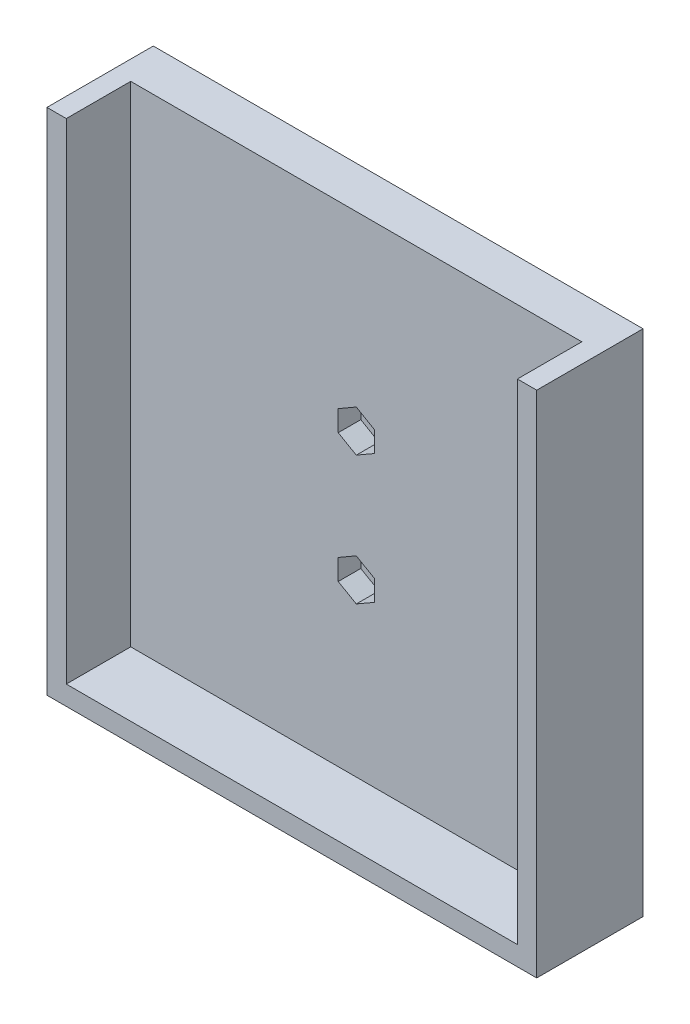
ISO-10303-21;
HEADER;
FILE_DESCRIPTION(('STEP AP214'),'2;1');
FILE_NAME('part.step','',(''),(''),'','','');
FILE_SCHEMA(('AUTOMOTIVE_DESIGN { 1 0 10303 214 1 1 1 1 }'));
ENDSEC;
DATA;
#1=APPLICATION_CONTEXT('core data for automotive mechanical design processes');
#2=APPLICATION_PROTOCOL_DEFINITION('international standard','automotive_design',2000,#1);
#3=PRODUCT_CONTEXT('',#1,'mechanical');
#4=PRODUCT('Part','Part','',(#3));
#5=PRODUCT_RELATED_PRODUCT_CATEGORY('part','',(#4));
#6=PRODUCT_DEFINITION_FORMATION('','',#4);
#7=PRODUCT_DEFINITION_CONTEXT('part definition',#1,'design');
#8=PRODUCT_DEFINITION('design','',#6,#7);
#9=PRODUCT_DEFINITION_SHAPE('','',#8);
#10=(LENGTH_UNIT() NAMED_UNIT(*) SI_UNIT(.MILLI.,.METRE.));
#11=(NAMED_UNIT(*) PLANE_ANGLE_UNIT() SI_UNIT($,.RADIAN.));
#12=(NAMED_UNIT(*) SI_UNIT($,.STERADIAN.) SOLID_ANGLE_UNIT());
#13=UNCERTAINTY_MEASURE_WITH_UNIT(LENGTH_MEASURE(1.E-05),#10,'distance_accuracy_value','');
#14=(GEOMETRIC_REPRESENTATION_CONTEXT(3) GLOBAL_UNCERTAINTY_ASSIGNED_CONTEXT((#13)) GLOBAL_UNIT_ASSIGNED_CONTEXT((#10,
#11,#12)) REPRESENTATION_CONTEXT('',''));
#15=CARTESIAN_POINT('',(0.,0.,0.));
#16=DIRECTION('',(0.,0.,1.));
#17=DIRECTION('',(1.,0.,0.));
#18=AXIS2_PLACEMENT_3D('',#15,#16,#17);
#19=CARTESIAN_POINT('',(0.,0.,3.));
#20=DIRECTION('',(0.,0.,1.));
#21=DIRECTION('',(1.,0.,0.));
#22=AXIS2_PLACEMENT_3D('',#19,#20,#21);
#23=PLANE('',#22);
#24=DIRECTION('',(-0.866025433586759,0.499999948380864,0.));
#25=VECTOR('',#24,1.);
#26=CARTESIAN_POINT('',(-2.86506319182696,-11.5790166188481,3.));
#27=LINE('',#26,#25);
#28=CARTESIAN_POINT('',(1.92711436808324E-07,-13.2331615074619,3.));
#29=VERTEX_POINT('',#28);
#30=CARTESIAN_POINT('',(-2.79999990364428,-11.6165809206239,3.));
#31=VERTEX_POINT('',#30);
#32=EDGE_CURVE('E387',#29,#31,#27,.T.);
#33=ORIENTED_EDGE('',*,*,#32,.T.);
#34=DIRECTION('',(-5.96046428127886E-08,1.,0.));
#35=VECTOR('',#34,1.);
#36=CARTESIAN_POINT('',(-2.80000024984535,-5.80829054375849,3.));
#37=LINE('',#36,#35);
#38=CARTESIAN_POINT('',(-2.80000009635571,-8.38341941316205,3.));
#39=VERTEX_POINT('',#38);
#40=EDGE_CURVE('E430',#31,#39,#37,.T.);
#41=ORIENTED_EDGE('',*,*,#40,.T.);
#42=DIRECTION('',(0.866025373982116,0.500000051619134,0.));
#43=VECTOR('',#42,1.);
#44=CARTESIAN_POINT('',(0.0650635380280448,-6.72927392491038,3.));
#45=LINE('',#44,#43);
#46=CARTESIAN_POINT('',(-1.92711437363435E-07,-6.7668384925381,3.));
#47=VERTEX_POINT('',#46);
#48=EDGE_CURVE('E375',#39,#47,#45,.T.);
#49=ORIENTED_EDGE('',*,*,#48,.T.);
#50=DIRECTION('',(0.866025433586759,-0.499999948380864,0.));
#51=VECTOR('',#50,1.);
#52=CARTESIAN_POINT('',(-1.46506352907198,-5.92098389734326,3.));
#53=LINE('',#52,#51);
#54=CARTESIAN_POINT('',(2.79999990364427,-8.38341907937605,3.));
#55=VERTEX_POINT('',#54);
#56=EDGE_CURVE('E337',#47,#55,#53,.T.);
#57=ORIENTED_EDGE('',*,*,#56,.T.);
#58=DIRECTION('',(5.96046429844817E-08,-1.,0.));
#59=VECTOR('',#58,1.);
#60=CARTESIAN_POINT('',(2.79999965379892,-4.19170945624154,3.));
#61=LINE('',#60,#59);
#62=CARTESIAN_POINT('',(2.80000009635571,-11.6165805868379,3.));
#63=VERTEX_POINT('',#62);
#64=EDGE_CURVE('E383',#55,#63,#61,.T.);
#65=ORIENTED_EDGE('',*,*,#64,.T.);
#66=DIRECTION('',(-0.866025373982116,-0.500000051619134,0.));
#67=VECTOR('',#66,1.);
#68=CARTESIAN_POINT('',(4.26506377891733,-10.7707255588983,3.));
#69=LINE('',#68,#67);
#70=EDGE_CURVE('E352',#63,#29,#69,.T.);
#71=ORIENTED_EDGE('',*,*,#70,.T.);
#72=EDGE_LOOP('',(#33,#41,#49,#57,#65,#71));
#73=FACE_BOUND('',#72,.T.);
#74=DIRECTION('',(-0.866025385157988,0.500000032261958,0.));
#75=VECTOR('',#74,1.);
#76=CARTESIAN_POINT('',(1.46506349720428,5.92098354573807,3.));
#77=LINE('',#76,#75);
#78=CARTESIAN_POINT('',(-1.2044464620109E-07,6.7668384925381,3.));
#79=VERTEX_POINT('',#78);
#80=CARTESIAN_POINT('',(-2.80000006022232,8.38341935057717,3.));
#81=VERTEX_POINT('',#80);
#82=EDGE_CURVE('E297',#79,#81,#77,.T.);
#83=ORIENTED_EDGE('',*,*,#82,.T.);
#84=DIRECTION('',(3.72529011141437E-08,1.,0.));
#85=VECTOR('',#84,1.);
#86=CARTESIAN_POINT('',(-2.80000021637566,4.19170972744265,3.));
#87=LINE('',#86,#85);
#88=CARTESIAN_POINT('',(-2.79999993977767,11.6165808580391,3.));
#89=VERTEX_POINT('',#88);
#90=EDGE_CURVE('E368',#81,#89,#87,.T.);
#91=ORIENTED_EDGE('',*,*,#90,.T.);
#92=DIRECTION('',(0.866025422410889,0.499999967738041,0.));
#93=VECTOR('',#92,1.);
#94=CARTESIAN_POINT('',(-4.26506334105093,10.7707261817046,3.));
#95=LINE('',#94,#93);
#96=CARTESIAN_POINT('',(1.20444646478646E-07,13.2331615074619,3.));
#97=VERTEX_POINT('',#96);
#98=EDGE_CURVE('E305',#89,#97,#95,.T.);
#99=ORIENTED_EDGE('',*,*,#98,.T.);
#100=DIRECTION('',(0.866025385157988,-0.500000032261958,0.));
#101=VECTOR('',#100,1.);
#102=CARTESIAN_POINT('',(2.86506370798241,11.5790161316423,3.));
#103=LINE('',#102,#101);
#104=CARTESIAN_POINT('',(2.80000006022232,11.6165806494228,3.));
#105=VERTEX_POINT('',#104);
#106=EDGE_CURVE('E310',#97,#105,#103,.T.);
#107=ORIENTED_EDGE('',*,*,#106,.T.);
#108=DIRECTION('',(-3.72529012858368E-08,-1.,0.));
#109=VECTOR('',#108,1.);
#110=CARTESIAN_POINT('',(2.79999984384665,5.80829027255736,3.));
#111=LINE('',#110,#109);
#112=CARTESIAN_POINT('',(2.79999993977767,8.38341914196093,3.));
#113=VERTEX_POINT('',#112);
#114=EDGE_CURVE('E316',#105,#113,#111,.T.);
#115=ORIENTED_EDGE('',*,*,#114,.T.);
#116=DIRECTION('',(-0.866025422410889,-0.499999967738041,0.));
#117=VECTOR('',#116,1.);
#118=CARTESIAN_POINT('',(-0.0650634916067439,6.72927414091501,3.));
#119=LINE('',#118,#117);
#120=EDGE_CURVE('E333',#113,#79,#119,.T.);
#121=ORIENTED_EDGE('',*,*,#120,.T.);
#122=EDGE_LOOP('',(#83,#91,#99,#107,#115,#121));
#123=FACE_BOUND('',#122,.T.);
#124=DIRECTION('',(1.,0.,0.));
#125=VECTOR('',#124,1.);
#126=CARTESIAN_POINT('',(14.,-36.5,3.));
#127=LINE('',#126,#125);
#128=CARTESIAN_POINT('',(-35.,-36.5,3.));
#129=VERTEX_POINT('',#128);
#130=CARTESIAN_POINT('',(35.,-36.5,3.));
#131=VERTEX_POINT('',#130);
#132=EDGE_CURVE('E439',#129,#131,#127,.T.);
#133=ORIENTED_EDGE('',*,*,#132,.T.);
#134=DIRECTION('',(0.,-1.,0.));
#135=VECTOR('',#134,1.);
#136=CARTESIAN_POINT('',(35.,49.9403065089106,3.));
#137=LINE('',#136,#135);
#138=CARTESIAN_POINT('',(35.,39.5,3.));
#139=VERTEX_POINT('',#138);
#140=EDGE_CURVE('E263',#139,#131,#137,.T.);
#141=ORIENTED_EDGE('',*,*,#140,.F.);
#142=DIRECTION('',(-1.,0.,0.));
#143=VECTOR('',#142,1.);
#144=CARTESIAN_POINT('',(31.,39.5,3.));
#145=LINE('',#144,#143);
#146=CARTESIAN_POINT('',(-35.,39.5,3.));
#147=VERTEX_POINT('',#146);
#148=EDGE_CURVE('E411',#139,#147,#145,.T.);
#149=ORIENTED_EDGE('',*,*,#148,.T.);
#150=DIRECTION('',(0.,-1.,0.));
#151=VECTOR('',#150,1.);
#152=CARTESIAN_POINT('',(-35.,49.9403065089106,3.));
#153=LINE('',#152,#151);
#154=EDGE_CURVE('E269',#147,#129,#153,.T.);
#155=ORIENTED_EDGE('',*,*,#154,.T.);
#156=EDGE_LOOP('',(#133,#141,#149,#155));
#157=FACE_BOUND('',#156,.T.);
#158=ADVANCED_FACE('F56',(#73,#123,#157),#23,.T.);
#159=CARTESIAN_POINT('',(28.,-36.5,0.));
#160=DIRECTION('',(0.,1.,0.));
#161=DIRECTION('',(1.,0.,0.));
#162=AXIS2_PLACEMENT_3D('',#159,#160,#161);
#163=PLANE('',#162);
#164=DIRECTION('',(-1.,0.,0.));
#165=VECTOR('',#164,1.);
#166=CARTESIAN_POINT('',(-28.,-36.5,13.));
#167=LINE('',#166,#165);
#168=CARTESIAN_POINT('',(35.,-36.5,13.));
#169=VERTEX_POINT('',#168);
#170=CARTESIAN_POINT('',(-35.,-36.5,13.));
#171=VERTEX_POINT('',#170);
#172=EDGE_CURVE('E301',#169,#171,#167,.T.);
#173=ORIENTED_EDGE('',*,*,#172,.F.);
#174=DIRECTION('',(0.,0.,1.));
#175=VECTOR('',#174,1.);
#176=CARTESIAN_POINT('',(35.,-36.5,13.));
#177=LINE('',#176,#175);
#178=EDGE_CURVE('E259',#131,#169,#177,.T.);
#179=ORIENTED_EDGE('',*,*,#178,.F.);
#180=ORIENTED_EDGE('',*,*,#132,.F.);
#181=DIRECTION('',(0.,0.,-1.));
#182=VECTOR('',#181,1.);
#183=CARTESIAN_POINT('',(-35.,-36.5,13.));
#184=LINE('',#183,#182);
#185=EDGE_CURVE('E267',#171,#129,#184,.T.);
#186=ORIENTED_EDGE('',*,*,#185,.F.);
#187=EDGE_LOOP('',(#173,#179,#180,#186));
#188=FACE_BOUND('',#187,.T.);
#189=ADVANCED_FACE('F658',(#188),#163,.T.);
#190=CARTESIAN_POINT('',(31.,39.5,0.));
#191=DIRECTION('',(0.,1.,0.));
#192=DIRECTION('',(1.,0.,0.));
#193=AXIS2_PLACEMENT_3D('',#190,#191,#192);
#194=PLANE('',#193);
#195=DIRECTION('',(-1.,0.,0.));
#196=VECTOR('',#195,1.);
#197=CARTESIAN_POINT('',(15.5,39.5,-3.5));
#198=LINE('',#197,#196);
#199=CARTESIAN_POINT('',(38.,39.5,-3.5));
#200=VERTEX_POINT('',#199);
#201=CARTESIAN_POINT('',(-38.,39.5,-3.5));
#202=VERTEX_POINT('',#201);
#203=EDGE_CURVE('E300',#200,#202,#198,.T.);
#204=ORIENTED_EDGE('',*,*,#203,.T.);
#205=DIRECTION('',(0.,0.,-1.));
#206=VECTOR('',#205,1.);
#207=CARTESIAN_POINT('',(-38.,39.5,3.));
#208=LINE('',#207,#206);
#209=CARTESIAN_POINT('',(-38.,39.5,13.));
#210=VERTEX_POINT('',#209);
#211=EDGE_CURVE('E286',#210,#202,#208,.T.);
#212=ORIENTED_EDGE('',*,*,#211,.F.);
#213=DIRECTION('',(1.,0.,0.));
#214=VECTOR('',#213,1.);
#215=CARTESIAN_POINT('',(-38.,39.5,13.));
#216=LINE('',#215,#214);
#217=CARTESIAN_POINT('',(-35.,39.5,13.));
#218=VERTEX_POINT('',#217);
#219=EDGE_CURVE('E275',#210,#218,#216,.T.);
#220=ORIENTED_EDGE('',*,*,#219,.T.);
#221=DIRECTION('',(0.,0.,-1.));
#222=VECTOR('',#221,1.);
#223=CARTESIAN_POINT('',(-35.,39.5,13.));
#224=LINE('',#223,#222);
#225=EDGE_CURVE('E271',#218,#147,#224,.T.);
#226=ORIENTED_EDGE('',*,*,#225,.T.);
#227=ORIENTED_EDGE('',*,*,#148,.F.);
#228=DIRECTION('',(0.,0.,1.));
#229=VECTOR('',#228,1.);
#230=CARTESIAN_POINT('',(35.,39.5,13.));
#231=LINE('',#230,#229);
#232=CARTESIAN_POINT('',(35.,39.5,13.));
#233=VERTEX_POINT('',#232);
#234=EDGE_CURVE('E256',#139,#233,#231,.T.);
#235=ORIENTED_EDGE('',*,*,#234,.T.);
#236=DIRECTION('',(1.,0.,0.));
#237=VECTOR('',#236,1.);
#238=CARTESIAN_POINT('',(38.,39.5,13.));
#239=LINE('',#238,#237);
#240=CARTESIAN_POINT('',(38.,39.5,13.));
#241=VERTEX_POINT('',#240);
#242=EDGE_CURVE('E248',#233,#241,#239,.T.);
#243=ORIENTED_EDGE('',*,*,#242,.T.);
#244=DIRECTION('',(0.,0.,1.));
#245=VECTOR('',#244,1.);
#246=CARTESIAN_POINT('',(38.,39.5,-3.5));
#247=LINE('',#246,#245);
#248=EDGE_CURVE('E234',#200,#241,#247,.T.);
#249=ORIENTED_EDGE('',*,*,#248,.F.);
#250=EDGE_LOOP('',(#204,#212,#220,#226,#227,#235,#243,#249));
#251=FACE_BOUND('',#250,.T.);
#252=ADVANCED_FACE('F254',(#251),#194,.T.);
#253=CARTESIAN_POINT('',(-31.,-39.5,0.));
#254=DIRECTION('',(0.,-1.,0.));
#255=DIRECTION('',(0.,0.,-1.));
#256=AXIS2_PLACEMENT_3D('',#253,#254,#255);
#257=PLANE('',#256);
#258=DIRECTION('',(1.,0.,0.));
#259=VECTOR('',#258,1.);
#260=CARTESIAN_POINT('',(-15.5,-39.5,-3.5));
#261=LINE('',#260,#259);
#262=CARTESIAN_POINT('',(-38.,-39.5,-3.5));
#263=VERTEX_POINT('',#262);
#264=CARTESIAN_POINT('',(38.,-39.5,-3.5));
#265=VERTEX_POINT('',#264);
#266=EDGE_CURVE('E423',#263,#265,#261,.T.);
#267=ORIENTED_EDGE('',*,*,#266,.T.);
#268=DIRECTION('',(0.,0.,-1.));
#269=VECTOR('',#268,1.);
#270=CARTESIAN_POINT('',(38.,-39.5,13.));
#271=LINE('',#270,#269);
#272=CARTESIAN_POINT('',(38.,-39.5,13.));
#273=VERTEX_POINT('',#272);
#274=EDGE_CURVE('E252',#273,#265,#271,.T.);
#275=ORIENTED_EDGE('',*,*,#274,.F.);
#276=DIRECTION('',(1.,0.,0.));
#277=VECTOR('',#276,1.);
#278=CARTESIAN_POINT('',(-31.,-39.5,13.));
#279=LINE('',#278,#277);
#280=CARTESIAN_POINT('',(-38.,-39.5,13.));
#281=VERTEX_POINT('',#280);
#282=EDGE_CURVE('E251',#281,#273,#279,.T.);
#283=ORIENTED_EDGE('',*,*,#282,.F.);
#284=DIRECTION('',(0.,0.,1.));
#285=VECTOR('',#284,1.);
#286=CARTESIAN_POINT('',(-38.,-39.5,-3.5));
#287=LINE('',#286,#285);
#288=EDGE_CURVE('E292',#263,#281,#287,.T.);
#289=ORIENTED_EDGE('',*,*,#288,.F.);
#290=EDGE_LOOP('',(#267,#275,#283,#289));
#291=FACE_BOUND('',#290,.T.);
#292=ADVANCED_FACE('F612',(#291),#257,.T.);
#293=CARTESIAN_POINT('',(0.,-10.,0.));
#294=DIRECTION('',(0.,0.,1.));
#295=DIRECTION('',(1.,0.,0.));
#296=AXIS2_PLACEMENT_3D('',#293,#294,#295);
#297=CYLINDRICAL_SURFACE('',#296,1.5);
#298=CARTESIAN_POINT('',(0.,-10.,-0.5));
#299=DIRECTION('',(0.,0.,1.));
#300=DIRECTION('',(1.,0.,0.));
#301=AXIS2_PLACEMENT_3D('',#298,#299,#300);
#302=CIRCLE('',#301,1.5);
#303=CARTESIAN_POINT('',(-1.5,-10.,-0.5));
#304=VERTEX_POINT('',#303);
#305=EDGE_CURVE('E436',#304,#304,#302,.T.);
#306=ORIENTED_EDGE('',*,*,#305,.T.);
#307=DIRECTION('',(0.,0.,-1.));
#308=VECTOR('',#307,1.);
#309=CARTESIAN_POINT('',(-1.5,-10.,0.));
#310=LINE('',#309,#308);
#311=CARTESIAN_POINT('',(-1.5,-10.,-3.5));
#312=VERTEX_POINT('',#311);
#313=EDGE_CURVE('E11',#304,#312,#310,.T.);
#314=ORIENTED_EDGE('',*,*,#313,.T.);
#315=CARTESIAN_POINT('',(0.,-10.,-3.5));
#316=DIRECTION('',(0.,0.,-1.));
#317=DIRECTION('',(1.,0.,0.));
#318=AXIS2_PLACEMENT_3D('',#315,#316,#317);
#319=CIRCLE('',#318,1.5);
#320=EDGE_CURVE('E414',#312,#312,#319,.T.);
#321=ORIENTED_EDGE('',*,*,#320,.T.);
#322=ORIENTED_EDGE('',*,*,#313,.F.);
#323=EDGE_LOOP('',(#306,#314,#321,#322));
#324=FACE_BOUND('',#323,.T.);
#325=ADVANCED_FACE('F604',(#324),#297,.F.);
#326=CARTESIAN_POINT('',(0.,10.,0.));
#327=DIRECTION('',(0.,0.,1.));
#328=DIRECTION('',(1.,0.,0.));
#329=AXIS2_PLACEMENT_3D('',#326,#327,#328);
#330=CYLINDRICAL_SURFACE('',#329,1.75);
#331=CARTESIAN_POINT('',(0.,10.,-0.5));
#332=DIRECTION('',(0.,0.,1.));
#333=DIRECTION('',(1.,0.,0.));
#334=AXIS2_PLACEMENT_3D('',#331,#332,#333);
#335=CIRCLE('',#334,1.75);
#336=CARTESIAN_POINT('',(-1.75,10.,-0.5));
#337=VERTEX_POINT('',#336);
#338=EDGE_CURVE('E379',#337,#337,#335,.T.);
#339=ORIENTED_EDGE('',*,*,#338,.T.);
#340=DIRECTION('',(0.,0.,-1.));
#341=VECTOR('',#340,1.);
#342=CARTESIAN_POINT('',(-1.75,10.,0.));
#343=LINE('',#342,#341);
#344=CARTESIAN_POINT('',(-1.75,10.,-3.5));
#345=VERTEX_POINT('',#344);
#346=EDGE_CURVE('E64',#337,#345,#343,.T.);
#347=ORIENTED_EDGE('',*,*,#346,.T.);
#348=CARTESIAN_POINT('',(0.,10.,-3.5));
#349=DIRECTION('',(0.,0.,-1.));
#350=DIRECTION('',(1.,0.,0.));
#351=AXIS2_PLACEMENT_3D('',#348,#349,#350);
#352=CIRCLE('',#351,1.75);
#353=EDGE_CURVE('E420',#345,#345,#352,.T.);
#354=ORIENTED_EDGE('',*,*,#353,.T.);
#355=ORIENTED_EDGE('',*,*,#346,.F.);
#356=EDGE_LOOP('',(#339,#347,#354,#355));
#357=FACE_BOUND('',#356,.T.);
#358=ADVANCED_FACE('F594',(#357),#330,.F.);
#359=CARTESIAN_POINT('',(0.,0.,-3.5));
#360=DIRECTION('',(0.,0.,1.));
#361=DIRECTION('',(1.,0.,0.));
#362=AXIS2_PLACEMENT_3D('',#359,#360,#361);
#363=PLANE('',#362);
#364=ORIENTED_EDGE('',*,*,#320,.F.);
#365=EDGE_LOOP('',(#364));
#366=FACE_BOUND('',#365,.T.);
#367=ORIENTED_EDGE('',*,*,#353,.F.);
#368=EDGE_LOOP('',(#367));
#369=FACE_BOUND('',#368,.T.);
#370=ORIENTED_EDGE('',*,*,#203,.F.);
#371=DIRECTION('',(0.,1.,0.));
#372=VECTOR('',#371,1.);
#373=CARTESIAN_POINT('',(38.,-39.5,-3.5));
#374=LINE('',#373,#372);
#375=EDGE_CURVE('E241',#265,#200,#374,.T.);
#376=ORIENTED_EDGE('',*,*,#375,.F.);
#377=ORIENTED_EDGE('',*,*,#266,.F.);
#378=DIRECTION('',(0.,-1.,0.));
#379=VECTOR('',#378,1.);
#380=CARTESIAN_POINT('',(-38.,39.5,-3.5));
#381=LINE('',#380,#379);
#382=EDGE_CURVE('E289',#202,#263,#381,.T.);
#383=ORIENTED_EDGE('',*,*,#382,.F.);
#384=EDGE_LOOP('',(#370,#376,#377,#383));
#385=FACE_BOUND('',#384,.T.);
#386=ADVANCED_FACE('F585',(#366,#369,#385),#363,.F.);
#387=CARTESIAN_POINT('',(0.,0.,13.));
#388=DIRECTION('',(0.,0.,1.));
#389=DIRECTION('',(1.,0.,0.));
#390=AXIS2_PLACEMENT_3D('',#387,#388,#389);
#391=PLANE('',#390);
#392=DIRECTION('',(0.,-1.,0.));
#393=VECTOR('',#392,1.);
#394=CARTESIAN_POINT('',(38.,-36.5,13.));
#395=LINE('',#394,#393);
#396=EDGE_CURVE('E238',#241,#273,#395,.T.);
#397=ORIENTED_EDGE('',*,*,#396,.F.);
#398=ORIENTED_EDGE('',*,*,#242,.F.);
#399=DIRECTION('',(0.,-1.,0.));
#400=VECTOR('',#399,1.);
#401=CARTESIAN_POINT('',(35.,49.9403065089106,13.));
#402=LINE('',#401,#400);
#403=EDGE_CURVE('E257',#233,#169,#402,.T.);
#404=ORIENTED_EDGE('',*,*,#403,.T.);
#405=ORIENTED_EDGE('',*,*,#172,.T.);
#406=DIRECTION('',(0.,-1.,0.));
#407=VECTOR('',#406,1.);
#408=CARTESIAN_POINT('',(-35.,49.9403065089106,13.));
#409=LINE('',#408,#407);
#410=EDGE_CURVE('E270',#218,#171,#409,.T.);
#411=ORIENTED_EDGE('',*,*,#410,.F.);
#412=ORIENTED_EDGE('',*,*,#219,.F.);
#413=DIRECTION('',(0.,1.,0.));
#414=VECTOR('',#413,1.);
#415=CARTESIAN_POINT('',(-38.,-39.5,13.));
#416=LINE('',#415,#414);
#417=EDGE_CURVE('E274',#281,#210,#416,.T.);
#418=ORIENTED_EDGE('',*,*,#417,.F.);
#419=ORIENTED_EDGE('',*,*,#282,.T.);
#420=EDGE_LOOP('',(#397,#398,#404,#405,#411,#412,#418,#419));
#421=FACE_BOUND('',#420,.T.);
#422=ADVANCED_FACE('F247',(#421),#391,.T.);
#423=CARTESIAN_POINT('',(0.,1.5,-0.5));
#424=DIRECTION('',(0.,0.,-1.));
#425=DIRECTION('',(0.,-1.,0.));
#426=AXIS2_PLACEMENT_3D('',#423,#424,#425);
#427=PLANE('',#426);
#428=ORIENTED_EDGE('',*,*,#305,.F.);
#429=EDGE_LOOP('',(#428));
#430=FACE_BOUND('',#429,.T.);
#431=DIRECTION('',(-5.96046428127886E-08,1.,0.));
#432=VECTOR('',#431,1.);
#433=CARTESIAN_POINT('',(-2.80000009635571,-8.38341941316205,-0.5));
#434=LINE('',#433,#432);
#435=CARTESIAN_POINT('',(-2.79999990364428,-11.6165809206239,-0.5));
#436=VERTEX_POINT('',#435);
#437=CARTESIAN_POINT('',(-2.80000009635571,-8.38341941316205,-0.5));
#438=VERTEX_POINT('',#437);
#439=EDGE_CURVE('E433',#436,#438,#434,.T.);
#440=ORIENTED_EDGE('',*,*,#439,.F.);
#441=DIRECTION('',(-0.866025433586759,0.499999948380864,0.));
#442=VECTOR('',#441,1.);
#443=CARTESIAN_POINT('',(-2.79999990364428,-11.6165809206239,-0.5));
#444=LINE('',#443,#442);
#445=CARTESIAN_POINT('',(1.92711436808324E-07,-13.2331615074619,-0.5));
#446=VERTEX_POINT('',#445);
#447=EDGE_CURVE('E353',#446,#436,#444,.T.);
#448=ORIENTED_EDGE('',*,*,#447,.F.);
#449=DIRECTION('',(-0.866025373982116,-0.500000051619134,0.));
#450=VECTOR('',#449,1.);
#451=CARTESIAN_POINT('',(1.92711436808324E-07,-13.2331615074619,-0.5));
#452=LINE('',#451,#450);
#453=CARTESIAN_POINT('',(2.80000009635571,-11.6165805868379,-0.5));
#454=VERTEX_POINT('',#453);
#455=EDGE_CURVE('E380',#454,#446,#452,.T.);
#456=ORIENTED_EDGE('',*,*,#455,.F.);
#457=DIRECTION('',(5.96046429844817E-08,-1.,0.));
#458=VECTOR('',#457,1.);
#459=CARTESIAN_POINT('',(2.80000009635571,-11.6165805868379,-0.5));
#460=LINE('',#459,#458);
#461=CARTESIAN_POINT('',(2.79999990364427,-8.38341907937605,-0.5));
#462=VERTEX_POINT('',#461);
#463=EDGE_CURVE('E334',#462,#454,#460,.T.);
#464=ORIENTED_EDGE('',*,*,#463,.F.);
#465=DIRECTION('',(0.866025433586759,-0.499999948380864,0.));
#466=VECTOR('',#465,1.);
#467=CARTESIAN_POINT('',(2.79999990364427,-8.38341907937605,-0.5));
#468=LINE('',#467,#466);
#469=CARTESIAN_POINT('',(-1.92711437363435E-07,-6.7668384925381,-0.5));
#470=VERTEX_POINT('',#469);
#471=EDGE_CURVE('E372',#470,#462,#468,.T.);
#472=ORIENTED_EDGE('',*,*,#471,.F.);
#473=DIRECTION('',(0.866025373982116,0.500000051619134,0.));
#474=VECTOR('',#473,1.);
#475=CARTESIAN_POINT('',(-1.92711437363435E-07,-6.7668384925381,-0.5));
#476=LINE('',#475,#474);
#477=EDGE_CURVE('E427',#438,#470,#476,.T.);
#478=ORIENTED_EDGE('',*,*,#477,.F.);
#479=EDGE_LOOP('',(#440,#448,#456,#464,#472,#478));
#480=FACE_BOUND('',#479,.T.);
#481=ADVANCED_FACE('F486',(#430,#480),#427,.F.);
#482=CARTESIAN_POINT('',(-2.79999990364428,-11.6165809206239,3.));
#483=DIRECTION('',(-1.,-5.96046428127886E-08,0.));
#484=DIRECTION('',(-5.96046428127886E-08,1.,0.));
#485=AXIS2_PLACEMENT_3D('',#482,#483,#484);
#486=PLANE('',#485);
#487=ORIENTED_EDGE('',*,*,#40,.F.);
#488=DIRECTION('',(0.,0.,-1.));
#489=VECTOR('',#488,1.);
#490=CARTESIAN_POINT('',(-2.79999990364428,-11.6165809206239,3.));
#491=LINE('',#490,#489);
#492=EDGE_CURVE('E348',#31,#436,#491,.T.);
#493=ORIENTED_EDGE('',*,*,#492,.T.);
#494=ORIENTED_EDGE('',*,*,#439,.T.);
#495=DIRECTION('',(0.,0.,-1.));
#496=VECTOR('',#495,1.);
#497=CARTESIAN_POINT('',(-2.80000009635571,-8.38341941316205,3.));
#498=LINE('',#497,#496);
#499=EDGE_CURVE('E419',#39,#438,#498,.T.);
#500=ORIENTED_EDGE('',*,*,#499,.F.);
#501=EDGE_LOOP('',(#487,#493,#494,#500));
#502=FACE_BOUND('',#501,.T.);
#503=ADVANCED_FACE('F471',(#502),#486,.F.);
#504=CARTESIAN_POINT('',(-2.80000009635571,-8.38341941316205,3.));
#505=DIRECTION('',(-0.500000051619134,0.866025373982116,0.));
#506=DIRECTION('',(0.,0.,1.));
#507=AXIS2_PLACEMENT_3D('',#504,#505,#506);
#508=PLANE('',#507);
#509=ORIENTED_EDGE('',*,*,#48,.F.);
#510=ORIENTED_EDGE('',*,*,#499,.T.);
#511=ORIENTED_EDGE('',*,*,#477,.T.);
#512=DIRECTION('',(0.,0.,-1.));
#513=VECTOR('',#512,1.);
#514=CARTESIAN_POINT('',(-1.92711437363435E-07,-6.7668384925381,3.));
#515=LINE('',#514,#513);
#516=EDGE_CURVE('E376',#47,#470,#515,.T.);
#517=ORIENTED_EDGE('',*,*,#516,.F.);
#518=EDGE_LOOP('',(#509,#510,#511,#517));
#519=FACE_BOUND('',#518,.T.);
#520=ADVANCED_FACE('F466',(#519),#508,.F.);
#521=CARTESIAN_POINT('',(-1.92711437363435E-07,-6.7668384925381,3.));
#522=DIRECTION('',(0.499999948380864,0.866025433586759,0.));
#523=DIRECTION('',(0.,0.,-1.));
#524=AXIS2_PLACEMENT_3D('',#521,#522,#523);
#525=PLANE('',#524);
#526=ORIENTED_EDGE('',*,*,#56,.F.);
#527=ORIENTED_EDGE('',*,*,#516,.T.);
#528=ORIENTED_EDGE('',*,*,#471,.T.);
#529=DIRECTION('',(0.,0.,-1.));
#530=VECTOR('',#529,1.);
#531=CARTESIAN_POINT('',(2.79999990364427,-8.38341907937605,3.));
#532=LINE('',#531,#530);
#533=EDGE_CURVE('E338',#55,#462,#532,.T.);
#534=ORIENTED_EDGE('',*,*,#533,.F.);
#535=EDGE_LOOP('',(#526,#527,#528,#534));
#536=FACE_BOUND('',#535,.T.);
#537=ADVANCED_FACE('F470',(#536),#525,.F.);
#538=CARTESIAN_POINT('',(2.79999990364427,-8.38341907937605,3.));
#539=DIRECTION('',(1.,5.96046429844817E-08,0.));
#540=DIRECTION('',(0.,0.,-1.));
#541=AXIS2_PLACEMENT_3D('',#538,#539,#540);
#542=PLANE('',#541);
#543=ORIENTED_EDGE('',*,*,#64,.F.);
#544=ORIENTED_EDGE('',*,*,#533,.T.);
#545=ORIENTED_EDGE('',*,*,#463,.T.);
#546=DIRECTION('',(0.,0.,-1.));
#547=VECTOR('',#546,1.);
#548=CARTESIAN_POINT('',(2.80000009635571,-11.6165805868379,3.));
#549=LINE('',#548,#547);
#550=EDGE_CURVE('E384',#63,#454,#549,.T.);
#551=ORIENTED_EDGE('',*,*,#550,.F.);
#552=EDGE_LOOP('',(#543,#544,#545,#551));
#553=FACE_BOUND('',#552,.T.);
#554=ADVANCED_FACE('F552',(#553),#542,.F.);
#555=CARTESIAN_POINT('',(2.80000009635571,-11.6165805868379,3.));
#556=DIRECTION('',(0.500000051619134,-0.866025373982116,0.));
#557=DIRECTION('',(0.,0.,-1.));
#558=AXIS2_PLACEMENT_3D('',#555,#556,#557);
#559=PLANE('',#558);
#560=ORIENTED_EDGE('',*,*,#70,.F.);
#561=ORIENTED_EDGE('',*,*,#550,.T.);
#562=ORIENTED_EDGE('',*,*,#455,.T.);
#563=DIRECTION('',(0.,0.,-1.));
#564=VECTOR('',#563,1.);
#565=CARTESIAN_POINT('',(1.92711436808324E-07,-13.2331615074619,3.));
#566=LINE('',#565,#564);
#567=EDGE_CURVE('E391',#29,#446,#566,.T.);
#568=ORIENTED_EDGE('',*,*,#567,.F.);
#569=EDGE_LOOP('',(#560,#561,#562,#568));
#570=FACE_BOUND('',#569,.T.);
#571=ADVANCED_FACE('F527',(#570),#559,.F.);
#572=CARTESIAN_POINT('',(1.92711436808324E-07,-13.2331615074619,3.));
#573=DIRECTION('',(-0.499999948380864,-0.866025433586759,0.));
#574=DIRECTION('',(-0.866025433586759,0.499999948380864,0.));
#575=AXIS2_PLACEMENT_3D('',#572,#573,#574);
#576=PLANE('',#575);
#577=ORIENTED_EDGE('',*,*,#32,.F.);
#578=ORIENTED_EDGE('',*,*,#567,.T.);
#579=ORIENTED_EDGE('',*,*,#447,.T.);
#580=ORIENTED_EDGE('',*,*,#492,.F.);
#581=EDGE_LOOP('',(#577,#578,#579,#580));
#582=FACE_BOUND('',#581,.T.);
#583=ADVANCED_FACE('F509',(#582),#576,.F.);
#584=CARTESIAN_POINT('',(0.,1.5,-0.5));
#585=DIRECTION('',(0.,0.,1.));
#586=DIRECTION('',(1.,0.,0.));
#587=AXIS2_PLACEMENT_3D('',#584,#585,#586);
#588=PLANE('',#587);
#589=ORIENTED_EDGE('',*,*,#338,.F.);
#590=EDGE_LOOP('',(#589));
#591=FACE_BOUND('',#590,.T.);
#592=DIRECTION('',(3.72529011141437E-08,1.,0.));
#593=VECTOR('',#592,1.);
#594=CARTESIAN_POINT('',(-2.79999993977767,11.6165808580391,-0.5));
#595=LINE('',#594,#593);
#596=CARTESIAN_POINT('',(-2.80000006022232,8.38341935057717,-0.5));
#597=VERTEX_POINT('',#596);
#598=CARTESIAN_POINT('',(-2.79999993977767,11.6165808580391,-0.5));
#599=VERTEX_POINT('',#598);
#600=EDGE_CURVE('E371',#597,#599,#595,.T.);
#601=ORIENTED_EDGE('',*,*,#600,.F.);
#602=DIRECTION('',(-0.866025385157988,0.500000032261958,0.));
#603=VECTOR('',#602,1.);
#604=CARTESIAN_POINT('',(-2.80000006022232,8.38341935057717,-0.5));
#605=LINE('',#604,#603);
#606=CARTESIAN_POINT('',(-1.20444646478646E-07,6.7668384925381,-0.5));
#607=VERTEX_POINT('',#606);
#608=EDGE_CURVE('E328',#607,#597,#605,.T.);
#609=ORIENTED_EDGE('',*,*,#608,.F.);
#610=DIRECTION('',(-0.866025422410889,-0.499999967738041,0.));
#611=VECTOR('',#610,1.);
#612=CARTESIAN_POINT('',(-1.2044464620109E-07,6.7668384925381,-0.5));
#613=LINE('',#612,#611);
#614=CARTESIAN_POINT('',(2.79999993977767,8.38341914196093,-0.5));
#615=VERTEX_POINT('',#614);
#616=EDGE_CURVE('E319',#615,#607,#613,.T.);
#617=ORIENTED_EDGE('',*,*,#616,.F.);
#618=DIRECTION('',(-3.72529012858368E-08,-1.,0.));
#619=VECTOR('',#618,1.);
#620=CARTESIAN_POINT('',(2.79999993977767,8.38341914196093,-0.5));
#621=LINE('',#620,#619);
#622=CARTESIAN_POINT('',(2.80000006022232,11.6165806494228,-0.5));
#623=VERTEX_POINT('',#622);
#624=EDGE_CURVE('E307',#623,#615,#621,.T.);
#625=ORIENTED_EDGE('',*,*,#624,.F.);
#626=DIRECTION('',(0.866025385157988,-0.500000032261958,0.));
#627=VECTOR('',#626,1.);
#628=CARTESIAN_POINT('',(2.80000006022232,11.6165806494228,-0.5));
#629=LINE('',#628,#627);
#630=CARTESIAN_POINT('',(1.20444646478646E-07,13.2331615074619,-0.5));
#631=VERTEX_POINT('',#630);
#632=EDGE_CURVE('E302',#631,#623,#629,.T.);
#633=ORIENTED_EDGE('',*,*,#632,.F.);
#634=DIRECTION('',(0.866025422410889,0.499999967738041,0.));
#635=VECTOR('',#634,1.);
#636=CARTESIAN_POINT('',(1.20444646478646E-07,13.2331615074619,-0.5));
#637=LINE('',#636,#635);
#638=EDGE_CURVE('E365',#599,#631,#637,.T.);
#639=ORIENTED_EDGE('',*,*,#638,.F.);
#640=EDGE_LOOP('',(#601,#609,#617,#625,#633,#639));
#641=FACE_BOUND('',#640,.T.);
#642=ADVANCED_FACE('F504',(#591,#641),#588,.T.);
#643=CARTESIAN_POINT('',(-2.80000006022232,8.38341935057717,3.));
#644=DIRECTION('',(-1.,3.72529011141437E-08,0.));
#645=DIRECTION('',(0.,0.,1.));
#646=AXIS2_PLACEMENT_3D('',#643,#644,#645);
#647=PLANE('',#646);
#648=ORIENTED_EDGE('',*,*,#90,.F.);
#649=DIRECTION('',(0.,0.,-1.));
#650=VECTOR('',#649,1.);
#651=CARTESIAN_POINT('',(-2.80000006022232,8.38341935057717,3.));
#652=LINE('',#651,#650);
#653=EDGE_CURVE('E342',#81,#597,#652,.T.);
#654=ORIENTED_EDGE('',*,*,#653,.T.);
#655=ORIENTED_EDGE('',*,*,#600,.T.);
#656=DIRECTION('',(0.,0.,-1.));
#657=VECTOR('',#656,1.);
#658=CARTESIAN_POINT('',(-2.79999993977767,11.6165808580391,3.));
#659=LINE('',#658,#657);
#660=EDGE_CURVE('E324',#89,#599,#659,.T.);
#661=ORIENTED_EDGE('',*,*,#660,.F.);
#662=EDGE_LOOP('',(#648,#654,#655,#661));
#663=FACE_BOUND('',#662,.T.);
#664=ADVANCED_FACE('F508',(#663),#647,.F.);
#665=CARTESIAN_POINT('',(-2.79999993977767,11.6165808580391,3.));
#666=DIRECTION('',(-0.499999967738041,0.866025422410889,0.));
#667=DIRECTION('',(0.,0.,1.));
#668=AXIS2_PLACEMENT_3D('',#665,#666,#667);
#669=PLANE('',#668);
#670=ORIENTED_EDGE('',*,*,#98,.F.);
#671=ORIENTED_EDGE('',*,*,#660,.T.);
#672=ORIENTED_EDGE('',*,*,#638,.T.);
#673=DIRECTION('',(0.,0.,-1.));
#674=VECTOR('',#673,1.);
#675=CARTESIAN_POINT('',(1.20444646478646E-07,13.2331615074619,3.));
#676=LINE('',#675,#674);
#677=EDGE_CURVE('E306',#97,#631,#676,.T.);
#678=ORIENTED_EDGE('',*,*,#677,.F.);
#679=EDGE_LOOP('',(#670,#671,#672,#678));
#680=FACE_BOUND('',#679,.T.);
#681=ADVANCED_FACE('F518',(#680),#669,.F.);
#682=CARTESIAN_POINT('',(1.20444646478646E-07,13.2331615074619,3.));
#683=DIRECTION('',(0.500000032261958,0.866025385157988,0.));
#684=DIRECTION('',(0.,0.,-1.));
#685=AXIS2_PLACEMENT_3D('',#682,#683,#684);
#686=PLANE('',#685);
#687=ORIENTED_EDGE('',*,*,#106,.F.);
#688=ORIENTED_EDGE('',*,*,#677,.T.);
#689=ORIENTED_EDGE('',*,*,#632,.T.);
#690=DIRECTION('',(0.,0.,-1.));
#691=VECTOR('',#690,1.);
#692=CARTESIAN_POINT('',(2.80000006022232,11.6165806494228,3.));
#693=LINE('',#692,#691);
#694=EDGE_CURVE('E311',#105,#623,#693,.T.);
#695=ORIENTED_EDGE('',*,*,#694,.F.);
#696=EDGE_LOOP('',(#687,#688,#689,#695));
#697=FACE_BOUND('',#696,.T.);
#698=ADVANCED_FACE('F498',(#697),#686,.F.);
#699=CARTESIAN_POINT('',(2.80000006022232,11.6165806494228,3.));
#700=DIRECTION('',(1.,-3.72529012858368E-08,0.));
#701=DIRECTION('',(0.,0.,-1.));
#702=AXIS2_PLACEMENT_3D('',#699,#700,#701);
#703=PLANE('',#702);
#704=ORIENTED_EDGE('',*,*,#114,.F.);
#705=ORIENTED_EDGE('',*,*,#694,.T.);
#706=ORIENTED_EDGE('',*,*,#624,.T.);
#707=DIRECTION('',(0.,0.,-1.));
#708=VECTOR('',#707,1.);
#709=CARTESIAN_POINT('',(2.79999993977767,8.38341914196093,3.));
#710=LINE('',#709,#708);
#711=EDGE_CURVE('E329',#113,#615,#710,.T.);
#712=ORIENTED_EDGE('',*,*,#711,.F.);
#713=EDGE_LOOP('',(#704,#705,#706,#712));
#714=FACE_BOUND('',#713,.T.);
#715=ADVANCED_FACE('F480',(#714),#703,.F.);
#716=CARTESIAN_POINT('',(2.79999993977767,8.38341914196093,3.));
#717=DIRECTION('',(0.499999967738041,-0.866025422410889,0.));
#718=DIRECTION('',(0.,0.,-1.));
#719=AXIS2_PLACEMENT_3D('',#716,#717,#718);
#720=PLANE('',#719);
#721=ORIENTED_EDGE('',*,*,#120,.F.);
#722=ORIENTED_EDGE('',*,*,#711,.T.);
#723=ORIENTED_EDGE('',*,*,#616,.T.);
#724=DIRECTION('',(0.,0.,-1.));
#725=VECTOR('',#724,1.);
#726=CARTESIAN_POINT('',(-1.2044464620109E-07,6.7668384925381,3.));
#727=LINE('',#726,#725);
#728=EDGE_CURVE('E315',#79,#607,#727,.T.);
#729=ORIENTED_EDGE('',*,*,#728,.F.);
#730=EDGE_LOOP('',(#721,#722,#723,#729));
#731=FACE_BOUND('',#730,.T.);
#732=ADVANCED_FACE('F460',(#731),#720,.F.);
#733=CARTESIAN_POINT('',(-1.20444645923534E-07,6.7668384925381,3.));
#734=DIRECTION('',(-0.500000032261958,-0.866025385157988,0.));
#735=DIRECTION('',(-0.866025385157988,0.500000032261958,0.));
#736=AXIS2_PLACEMENT_3D('',#733,#734,#735);
#737=PLANE('',#736);
#738=ORIENTED_EDGE('',*,*,#82,.F.);
#739=ORIENTED_EDGE('',*,*,#728,.T.);
#740=ORIENTED_EDGE('',*,*,#608,.T.);
#741=ORIENTED_EDGE('',*,*,#653,.F.);
#742=EDGE_LOOP('',(#738,#739,#740,#741));
#743=FACE_BOUND('',#742,.T.);
#744=ADVANCED_FACE('F455',(#743),#737,.F.);
#745=CARTESIAN_POINT('',(38.,0.,0.));
#746=DIRECTION('',(1.,0.,0.));
#747=DIRECTION('',(0.,0.,-1.));
#748=AXIS2_PLACEMENT_3D('',#745,#746,#747);
#749=PLANE('',#748);
#750=ORIENTED_EDGE('',*,*,#375,.T.);
#751=ORIENTED_EDGE('',*,*,#248,.T.);
#752=ORIENTED_EDGE('',*,*,#396,.T.);
#753=ORIENTED_EDGE('',*,*,#274,.T.);
#754=EDGE_LOOP('',(#750,#751,#752,#753));
#755=FACE_BOUND('',#754,.T.);
#756=ADVANCED_FACE('F236',(#755),#749,.T.);
#757=CARTESIAN_POINT('',(-38.,0.,0.));
#758=DIRECTION('',(-1.,0.,0.));
#759=DIRECTION('',(0.,0.,1.));
#760=AXIS2_PLACEMENT_3D('',#757,#758,#759);
#761=PLANE('',#760);
#762=ORIENTED_EDGE('',*,*,#417,.T.);
#763=ORIENTED_EDGE('',*,*,#211,.T.);
#764=ORIENTED_EDGE('',*,*,#382,.T.);
#765=ORIENTED_EDGE('',*,*,#288,.T.);
#766=EDGE_LOOP('',(#762,#763,#764,#765));
#767=FACE_BOUND('',#766,.T.);
#768=ADVANCED_FACE('F696',(#767),#761,.T.);
#769=CARTESIAN_POINT('',(-35.,49.9403065089106,13.));
#770=DIRECTION('',(-1.,0.,0.));
#771=DIRECTION('',(0.,0.,1.));
#772=AXIS2_PLACEMENT_3D('',#769,#770,#771);
#773=PLANE('',#772);
#774=ORIENTED_EDGE('',*,*,#225,.F.);
#775=ORIENTED_EDGE('',*,*,#410,.T.);
#776=ORIENTED_EDGE('',*,*,#185,.T.);
#777=ORIENTED_EDGE('',*,*,#154,.F.);
#778=EDGE_LOOP('',(#774,#775,#776,#777));
#779=FACE_BOUND('',#778,.T.);
#780=ADVANCED_FACE('F712',(#779),#773,.F.);
#781=CARTESIAN_POINT('',(35.,49.9403065089106,13.));
#782=DIRECTION('',(1.,0.,0.));
#783=DIRECTION('',(0.,0.,-1.));
#784=AXIS2_PLACEMENT_3D('',#781,#782,#783);
#785=PLANE('',#784);
#786=ORIENTED_EDGE('',*,*,#234,.F.);
#787=ORIENTED_EDGE('',*,*,#140,.T.);
#788=ORIENTED_EDGE('',*,*,#178,.T.);
#789=ORIENTED_EDGE('',*,*,#403,.F.);
#790=EDGE_LOOP('',(#786,#787,#788,#789));
#791=FACE_BOUND('',#790,.T.);
#792=ADVANCED_FACE('F725',(#791),#785,.F.);
#793=CLOSED_SHELL('',(#158,#189,#252,#292,#325,#358,#386,#422,#481,#503,#520,#537,#554,#571,
#583,#642,#664,#681,#698,#715,#732,#744,#756,#768,#780,#792));
#794=MANIFOLD_SOLID_BREP('B2',#793);
#795=ADVANCED_BREP_SHAPE_REPRESENTATION('',(#18,#794),#14);
#796=SHAPE_DEFINITION_REPRESENTATION(#9,#795);
ENDSEC;
END-ISO-10303-21;
